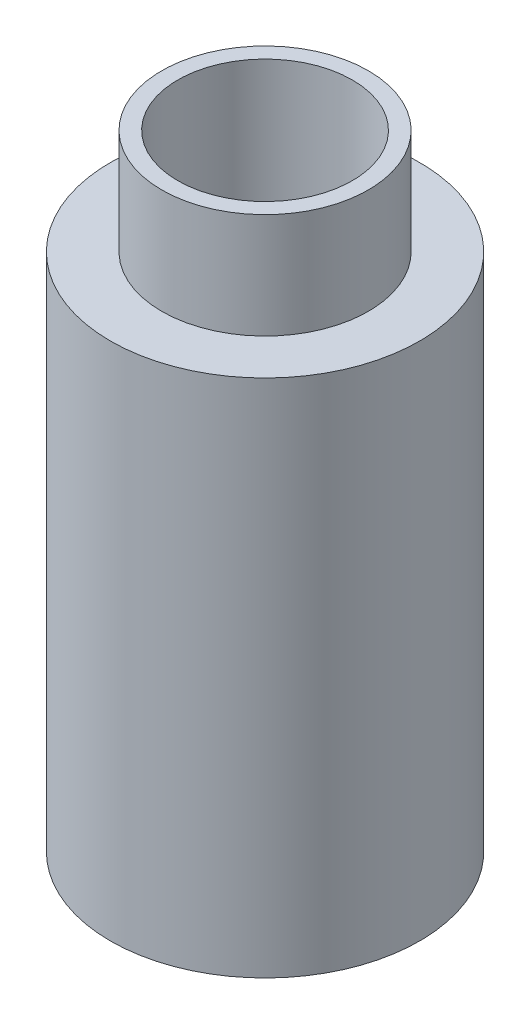
ISO-10303-21;
HEADER;
FILE_DESCRIPTION(('STEP AP214'),'2;1');
FILE_NAME('part.step','',(''),(''),'','','');
FILE_SCHEMA(('AUTOMOTIVE_DESIGN { 1 0 10303 214 1 1 1 1 }'));
ENDSEC;
DATA;
#1=APPLICATION_CONTEXT('core data for automotive mechanical design processes');
#2=APPLICATION_PROTOCOL_DEFINITION('international standard','automotive_design',2000,#1);
#3=PRODUCT_CONTEXT('',#1,'mechanical');
#4=PRODUCT('Part','Part','',(#3));
#5=PRODUCT_RELATED_PRODUCT_CATEGORY('part','',(#4));
#6=PRODUCT_DEFINITION_FORMATION('','',#4);
#7=PRODUCT_DEFINITION_CONTEXT('part definition',#1,'design');
#8=PRODUCT_DEFINITION('design','',#6,#7);
#9=PRODUCT_DEFINITION_SHAPE('','',#8);
#10=(LENGTH_UNIT() NAMED_UNIT(*) SI_UNIT(.MILLI.,.METRE.));
#11=(NAMED_UNIT(*) PLANE_ANGLE_UNIT() SI_UNIT($,.RADIAN.));
#12=(NAMED_UNIT(*) SI_UNIT($,.STERADIAN.) SOLID_ANGLE_UNIT());
#13=UNCERTAINTY_MEASURE_WITH_UNIT(LENGTH_MEASURE(1.E-05),#10,'distance_accuracy_value','');
#14=(GEOMETRIC_REPRESENTATION_CONTEXT(3) GLOBAL_UNCERTAINTY_ASSIGNED_CONTEXT((#13)) GLOBAL_UNIT_ASSIGNED_CONTEXT((#10,
#11,#12)) REPRESENTATION_CONTEXT('',''));
#15=CARTESIAN_POINT('',(0.,0.,0.));
#16=DIRECTION('',(0.,0.,1.));
#17=DIRECTION('',(1.,0.,0.));
#18=AXIS2_PLACEMENT_3D('',#15,#16,#17);
#19=CARTESIAN_POINT('',(0.,31.75,0.));
#20=DIRECTION('',(0.,1.,0.));
#21=DIRECTION('',(0.,0.,1.));
#22=AXIS2_PLACEMENT_3D('',#19,#20,#21);
#23=PLANE('',#22);
#24=CARTESIAN_POINT('',(0.,31.75,0.));
#25=DIRECTION('',(0.,1.,0.));
#26=DIRECTION('',(0.,0.,1.));
#27=AXIS2_PLACEMENT_3D('',#24,#25,#26);
#28=CIRCLE('',#27,9.4488);
#29=CARTESIAN_POINT('',(0.,31.75,9.4488));
#30=VERTEX_POINT('',#29);
#31=EDGE_CURVE('E10',#30,#30,#28,.T.);
#32=ORIENTED_EDGE('',*,*,#31,.T.);
#33=EDGE_LOOP('',(#32));
#34=FACE_BOUND('',#33,.T.);
#35=CARTESIAN_POINT('',(0.,31.75,0.));
#36=DIRECTION('',(0.,1.,0.));
#37=DIRECTION('',(0.,0.,1.));
#38=AXIS2_PLACEMENT_3D('',#35,#36,#37);
#39=CIRCLE('',#38,6.3119);
#40=CARTESIAN_POINT('',(0.,31.75,6.3119));
#41=VERTEX_POINT('',#40);
#42=EDGE_CURVE('E44',#41,#41,#39,.T.);
#43=ORIENTED_EDGE('',*,*,#42,.F.);
#44=EDGE_LOOP('',(#43));
#45=FACE_BOUND('',#44,.T.);
#46=ADVANCED_FACE('F31',(#34,#45),#23,.T.);
#47=CARTESIAN_POINT('',(0.,31.75,0.));
#48=DIRECTION('',(0.,-1.,0.));
#49=DIRECTION('',(0.,0.,-1.));
#50=AXIS2_PLACEMENT_3D('',#47,#48,#49);
#51=CYLINDRICAL_SURFACE('',#50,9.4488);
#52=ORIENTED_EDGE('',*,*,#31,.F.);
#53=EDGE_LOOP('',(#52));
#54=FACE_BOUND('',#53,.T.);
#55=CARTESIAN_POINT('',(0.,0.,0.));
#56=DIRECTION('',(0.,1.,0.));
#57=DIRECTION('',(0.,0.,1.));
#58=AXIS2_PLACEMENT_3D('',#55,#56,#57);
#59=CIRCLE('',#58,9.4488);
#60=CARTESIAN_POINT('',(0.,0.,9.4488));
#61=VERTEX_POINT('',#60);
#62=EDGE_CURVE('E35',#61,#61,#59,.T.);
#63=ORIENTED_EDGE('',*,*,#62,.T.);
#64=EDGE_LOOP('',(#63));
#65=FACE_BOUND('',#64,.T.);
#66=ADVANCED_FACE('F33',(#54,#65),#51,.T.);
#67=CARTESIAN_POINT('',(0.,0.,0.));
#68=DIRECTION('',(0.,1.,0.));
#69=DIRECTION('',(0.,0.,1.));
#70=AXIS2_PLACEMENT_3D('',#67,#68,#69);
#71=PLANE('',#70);
#72=CARTESIAN_POINT('',(0.,0.,0.));
#73=DIRECTION('',(0.,1.,0.));
#74=DIRECTION('',(0.,0.,1.));
#75=AXIS2_PLACEMENT_3D('',#72,#73,#74);
#76=CIRCLE('',#75,5.334);
#77=CARTESIAN_POINT('',(0.,0.,5.334));
#78=VERTEX_POINT('',#77);
#79=EDGE_CURVE('E47',#78,#78,#76,.T.);
#80=ORIENTED_EDGE('',*,*,#79,.T.);
#81=EDGE_LOOP('',(#80));
#82=FACE_BOUND('',#81,.T.);
#83=ORIENTED_EDGE('',*,*,#62,.F.);
#84=EDGE_LOOP('',(#83));
#85=FACE_BOUND('',#84,.T.);
#86=ADVANCED_FACE('F56',(#82,#85),#71,.F.);
#87=CARTESIAN_POINT('',(0.,38.1762,0.));
#88=DIRECTION('',(0.,-1.,0.));
#89=DIRECTION('',(0.,0.,-1.));
#90=AXIS2_PLACEMENT_3D('',#87,#88,#89);
#91=CYLINDRICAL_SURFACE('',#90,6.3119);
#92=CARTESIAN_POINT('',(0.,38.1762,0.));
#93=DIRECTION('',(0.,1.,0.));
#94=DIRECTION('',(0.,0.,1.));
#95=AXIS2_PLACEMENT_3D('',#92,#93,#94);
#96=CIRCLE('',#95,6.3119);
#97=CARTESIAN_POINT('',(0.,38.1762,6.3119));
#98=VERTEX_POINT('',#97);
#99=EDGE_CURVE('E42',#98,#98,#96,.T.);
#100=ORIENTED_EDGE('',*,*,#99,.F.);
#101=EDGE_LOOP('',(#100));
#102=FACE_BOUND('',#101,.T.);
#103=ORIENTED_EDGE('',*,*,#42,.T.);
#104=EDGE_LOOP('',(#103));
#105=FACE_BOUND('',#104,.T.);
#106=ADVANCED_FACE('F68',(#102,#105),#91,.T.);
#107=CARTESIAN_POINT('',(0.,38.1762,0.));
#108=DIRECTION('',(0.,1.,0.));
#109=DIRECTION('',(0.,0.,1.));
#110=AXIS2_PLACEMENT_3D('',#107,#108,#109);
#111=PLANE('',#110);
#112=CARTESIAN_POINT('',(0.,38.1762,0.));
#113=DIRECTION('',(0.,1.,0.));
#114=DIRECTION('',(0.,0.,1.));
#115=AXIS2_PLACEMENT_3D('',#112,#113,#114);
#116=CIRCLE('',#115,5.334);
#117=CARTESIAN_POINT('',(0.,38.1762,5.334));
#118=VERTEX_POINT('',#117);
#119=EDGE_CURVE('E50',#118,#118,#116,.T.);
#120=ORIENTED_EDGE('',*,*,#119,.F.);
#121=EDGE_LOOP('',(#120));
#122=FACE_BOUND('',#121,.T.);
#123=ORIENTED_EDGE('',*,*,#99,.T.);
#124=EDGE_LOOP('',(#123));
#125=FACE_BOUND('',#124,.T.);
#126=ADVANCED_FACE('F62',(#122,#125),#111,.T.);
#127=CARTESIAN_POINT('',(0.,0.,0.));
#128=DIRECTION('',(0.,1.,0.));
#129=DIRECTION('',(0.,0.,1.));
#130=AXIS2_PLACEMENT_3D('',#127,#128,#129);
#131=CYLINDRICAL_SURFACE('',#130,5.334);
#132=ORIENTED_EDGE('',*,*,#79,.F.);
#133=EDGE_LOOP('',(#132));
#134=FACE_BOUND('',#133,.T.);
#135=ORIENTED_EDGE('',*,*,#119,.T.);
#136=EDGE_LOOP('',(#135));
#137=FACE_BOUND('',#136,.T.);
#138=ADVANCED_FACE('F59',(#134,#137),#131,.F.);
#139=CLOSED_SHELL('',(#46,#66,#86,#106,#126,#138));
#140=MANIFOLD_SOLID_BREP('B2',#139);
#141=ADVANCED_BREP_SHAPE_REPRESENTATION('',(#18,#140),#14);
#142=SHAPE_DEFINITION_REPRESENTATION(#9,#141);
ENDSEC;
END-ISO-10303-21;
